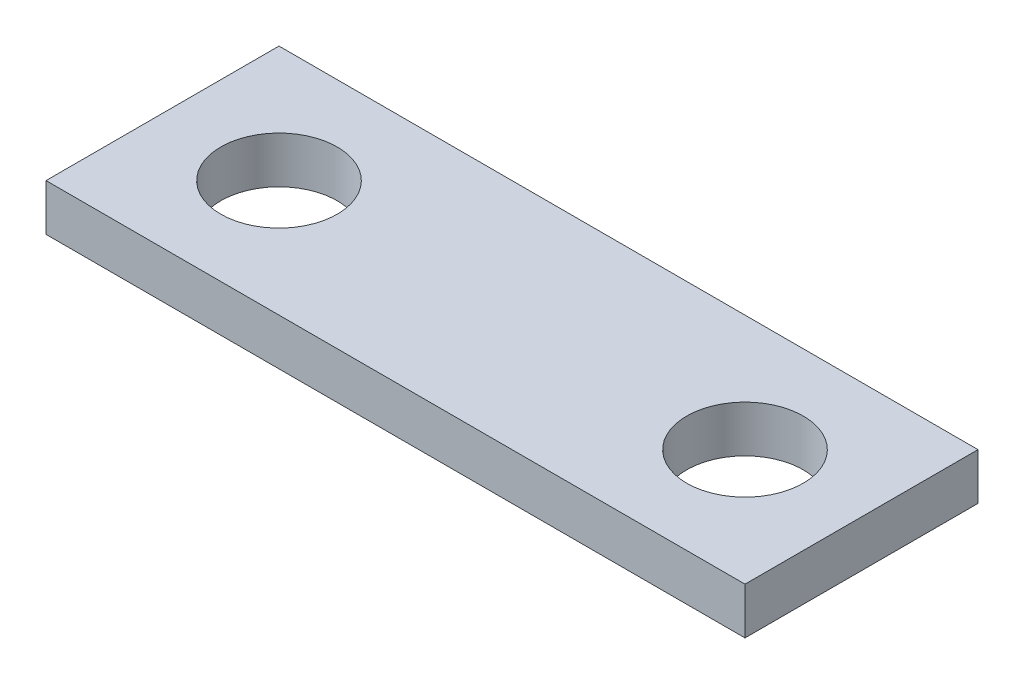
ISO-10303-21;
HEADER;
FILE_DESCRIPTION(('STEP AP214'),'2;1');
FILE_NAME('part.step','',(''),(''),'','','');
FILE_SCHEMA(('AUTOMOTIVE_DESIGN { 1 0 10303 214 1 1 1 1 }'));
ENDSEC;
DATA;
#1=APPLICATION_CONTEXT('core data for automotive mechanical design processes');
#2=APPLICATION_PROTOCOL_DEFINITION('international standard','automotive_design',2000,#1);
#3=PRODUCT_CONTEXT('',#1,'mechanical');
#4=PRODUCT('Part','Part','',(#3));
#5=PRODUCT_RELATED_PRODUCT_CATEGORY('part','',(#4));
#6=PRODUCT_DEFINITION_FORMATION('','',#4);
#7=PRODUCT_DEFINITION_CONTEXT('part definition',#1,'design');
#8=PRODUCT_DEFINITION('design','',#6,#7);
#9=PRODUCT_DEFINITION_SHAPE('','',#8);
#10=(LENGTH_UNIT() NAMED_UNIT(*) SI_UNIT(.MILLI.,.METRE.));
#11=(NAMED_UNIT(*) PLANE_ANGLE_UNIT() SI_UNIT($,.RADIAN.));
#12=(NAMED_UNIT(*) SI_UNIT($,.STERADIAN.) SOLID_ANGLE_UNIT());
#13=UNCERTAINTY_MEASURE_WITH_UNIT(LENGTH_MEASURE(1.E-05),#10,'distance_accuracy_value','');
#14=(GEOMETRIC_REPRESENTATION_CONTEXT(3) GLOBAL_UNCERTAINTY_ASSIGNED_CONTEXT((#13)) GLOBAL_UNIT_ASSIGNED_CONTEXT((#10,
#11,#12)) REPRESENTATION_CONTEXT('',''));
#15=CARTESIAN_POINT('',(0.,0.,0.));
#16=DIRECTION('',(0.,0.,1.));
#17=DIRECTION('',(1.,0.,0.));
#18=AXIS2_PLACEMENT_3D('',#15,#16,#17);
#19=CARTESIAN_POINT('',(0.,2.,5.));
#20=DIRECTION('',(0.,0.,-1.));
#21=DIRECTION('',(-1.,0.,0.));
#22=AXIS2_PLACEMENT_3D('',#19,#20,#21);
#23=PLANE('',#22);
#24=DIRECTION('',(1.,0.,0.));
#25=VECTOR('',#24,1.);
#26=CARTESIAN_POINT('',(0.,0.,5.));
#27=LINE('',#26,#25);
#28=CARTESIAN_POINT('',(-15.,0.,5.));
#29=VERTEX_POINT('',#28);
#30=CARTESIAN_POINT('',(15.,0.,5.));
#31=VERTEX_POINT('',#30);
#32=EDGE_CURVE('E124',#29,#31,#27,.T.);
#33=ORIENTED_EDGE('',*,*,#32,.T.);
#34=DIRECTION('',(0.,-1.,0.));
#35=VECTOR('',#34,1.);
#36=CARTESIAN_POINT('',(15.,2.,5.));
#37=LINE('',#36,#35);
#38=CARTESIAN_POINT('',(15.,2.,5.));
#39=VERTEX_POINT('',#38);
#40=EDGE_CURVE('E11',#39,#31,#37,.T.);
#41=ORIENTED_EDGE('',*,*,#40,.F.);
#42=DIRECTION('',(1.,0.,0.));
#43=VECTOR('',#42,1.);
#44=CARTESIAN_POINT('',(0.,2.,5.));
#45=LINE('',#44,#43);
#46=CARTESIAN_POINT('',(-15.,2.,5.));
#47=VERTEX_POINT('',#46);
#48=EDGE_CURVE('E98',#47,#39,#45,.T.);
#49=ORIENTED_EDGE('',*,*,#48,.F.);
#50=DIRECTION('',(0.,-1.,0.));
#51=VECTOR('',#50,1.);
#52=CARTESIAN_POINT('',(-15.,2.,5.));
#53=LINE('',#52,#51);
#54=EDGE_CURVE('E65',#47,#29,#53,.T.);
#55=ORIENTED_EDGE('',*,*,#54,.T.);
#56=EDGE_LOOP('',(#33,#41,#49,#55));
#57=FACE_BOUND('',#56,.T.);
#58=ADVANCED_FACE('F47',(#57),#23,.F.);
#59=CARTESIAN_POINT('',(15.,2.,0.));
#60=DIRECTION('',(-1.,0.,0.));
#61=DIRECTION('',(0.,0.,1.));
#62=AXIS2_PLACEMENT_3D('',#59,#60,#61);
#63=PLANE('',#62);
#64=DIRECTION('',(0.,0.,-1.));
#65=VECTOR('',#64,1.);
#66=CARTESIAN_POINT('',(15.,0.,0.));
#67=LINE('',#66,#65);
#68=CARTESIAN_POINT('',(15.,0.,-5.));
#69=VERTEX_POINT('',#68);
#70=EDGE_CURVE('E104',#31,#69,#67,.T.);
#71=ORIENTED_EDGE('',*,*,#70,.T.);
#72=DIRECTION('',(0.,-1.,0.));
#73=VECTOR('',#72,1.);
#74=CARTESIAN_POINT('',(15.,2.,-5.));
#75=LINE('',#74,#73);
#76=CARTESIAN_POINT('',(15.,2.,-5.));
#77=VERTEX_POINT('',#76);
#78=EDGE_CURVE('E57',#77,#69,#75,.T.);
#79=ORIENTED_EDGE('',*,*,#78,.F.);
#80=DIRECTION('',(0.,0.,-1.));
#81=VECTOR('',#80,1.);
#82=CARTESIAN_POINT('',(15.,2.,0.));
#83=LINE('',#82,#81);
#84=EDGE_CURVE('E90',#39,#77,#83,.T.);
#85=ORIENTED_EDGE('',*,*,#84,.F.);
#86=ORIENTED_EDGE('',*,*,#40,.T.);
#87=EDGE_LOOP('',(#71,#79,#85,#86));
#88=FACE_BOUND('',#87,.T.);
#89=ADVANCED_FACE('F103',(#88),#63,.F.);
#90=CARTESIAN_POINT('',(0.,2.,-5.));
#91=DIRECTION('',(0.,0.,-1.));
#92=DIRECTION('',(-1.,0.,0.));
#93=AXIS2_PLACEMENT_3D('',#90,#91,#92);
#94=PLANE('',#93);
#95=DIRECTION('',(1.,0.,0.));
#96=VECTOR('',#95,1.);
#97=CARTESIAN_POINT('',(0.,0.,-5.));
#98=LINE('',#97,#96);
#99=CARTESIAN_POINT('',(-15.,0.,-5.));
#100=VERTEX_POINT('',#99);
#101=EDGE_CURVE('E129',#100,#69,#98,.T.);
#102=ORIENTED_EDGE('',*,*,#101,.F.);
#103=DIRECTION('',(0.,-1.,0.));
#104=VECTOR('',#103,1.);
#105=CARTESIAN_POINT('',(-15.,2.,-5.));
#106=LINE('',#105,#104);
#107=CARTESIAN_POINT('',(-15.,2.,-5.));
#108=VERTEX_POINT('',#107);
#109=EDGE_CURVE('E79',#108,#100,#106,.T.);
#110=ORIENTED_EDGE('',*,*,#109,.F.);
#111=DIRECTION('',(1.,0.,0.));
#112=VECTOR('',#111,1.);
#113=CARTESIAN_POINT('',(0.,2.,-5.));
#114=LINE('',#113,#112);
#115=EDGE_CURVE('E97',#108,#77,#114,.T.);
#116=ORIENTED_EDGE('',*,*,#115,.T.);
#117=ORIENTED_EDGE('',*,*,#78,.T.);
#118=EDGE_LOOP('',(#102,#110,#116,#117));
#119=FACE_BOUND('',#118,.T.);
#120=ADVANCED_FACE('F108',(#119),#94,.T.);
#121=CARTESIAN_POINT('',(-10.,2.,0.));
#122=DIRECTION('',(0.,-1.,0.));
#123=DIRECTION('',(0.,0.,-1.));
#124=AXIS2_PLACEMENT_3D('',#121,#122,#123);
#125=CYLINDRICAL_SURFACE('',#124,2.5);
#126=CARTESIAN_POINT('',(-10.,2.,0.));
#127=DIRECTION('',(0.,1.,0.));
#128=DIRECTION('',(0.,0.,1.));
#129=AXIS2_PLACEMENT_3D('',#126,#127,#128);
#130=CIRCLE('',#129,2.5);
#131=CARTESIAN_POINT('',(-10.,2.,2.5));
#132=VERTEX_POINT('',#131);
#133=EDGE_CURVE('E143',#132,#132,#130,.T.);
#134=ORIENTED_EDGE('',*,*,#133,.T.);
#135=EDGE_LOOP('',(#134));
#136=FACE_BOUND('',#135,.T.);
#137=CARTESIAN_POINT('',(-10.,0.,0.));
#138=DIRECTION('',(0.,1.,0.));
#139=DIRECTION('',(0.,0.,1.));
#140=AXIS2_PLACEMENT_3D('',#137,#138,#139);
#141=CIRCLE('',#140,2.5);
#142=CARTESIAN_POINT('',(-10.,0.,2.5));
#143=VERTEX_POINT('',#142);
#144=EDGE_CURVE('E120',#143,#143,#141,.T.);
#145=ORIENTED_EDGE('',*,*,#144,.F.);
#146=EDGE_LOOP('',(#145));
#147=FACE_BOUND('',#146,.T.);
#148=ADVANCED_FACE('F153',(#136,#147),#125,.F.);
#149=CARTESIAN_POINT('',(9.99999999999999,2.,0.));
#150=DIRECTION('',(0.,-1.,0.));
#151=DIRECTION('',(0.,0.,-1.));
#152=AXIS2_PLACEMENT_3D('',#149,#150,#151);
#153=CYLINDRICAL_SURFACE('',#152,2.5);
#154=CARTESIAN_POINT('',(9.99999999999999,2.,0.));
#155=DIRECTION('',(0.,1.,0.));
#156=DIRECTION('',(0.,0.,1.));
#157=AXIS2_PLACEMENT_3D('',#154,#155,#156);
#158=CIRCLE('',#157,2.5);
#159=CARTESIAN_POINT('',(9.99999999999999,2.,2.5));
#160=VERTEX_POINT('',#159);
#161=EDGE_CURVE('E136',#160,#160,#158,.T.);
#162=ORIENTED_EDGE('',*,*,#161,.T.);
#163=EDGE_LOOP('',(#162));
#164=FACE_BOUND('',#163,.T.);
#165=CARTESIAN_POINT('',(9.99999999999999,0.,0.));
#166=DIRECTION('',(0.,1.,0.));
#167=DIRECTION('',(0.,0.,1.));
#168=AXIS2_PLACEMENT_3D('',#165,#166,#167);
#169=CIRCLE('',#168,2.5);
#170=CARTESIAN_POINT('',(9.99999999999999,0.,2.5));
#171=VERTEX_POINT('',#170);
#172=EDGE_CURVE('E116',#171,#171,#169,.T.);
#173=ORIENTED_EDGE('',*,*,#172,.F.);
#174=EDGE_LOOP('',(#173));
#175=FACE_BOUND('',#174,.T.);
#176=ADVANCED_FACE('F49',(#164,#175),#153,.F.);
#177=CARTESIAN_POINT('',(-15.,2.,0.));
#178=DIRECTION('',(-1.,0.,0.));
#179=DIRECTION('',(0.,0.,1.));
#180=AXIS2_PLACEMENT_3D('',#177,#178,#179);
#181=PLANE('',#180);
#182=DIRECTION('',(0.,0.,-1.));
#183=VECTOR('',#182,1.);
#184=CARTESIAN_POINT('',(-15.,0.,0.));
#185=LINE('',#184,#183);
#186=EDGE_CURVE('E132',#29,#100,#185,.T.);
#187=ORIENTED_EDGE('',*,*,#186,.F.);
#188=ORIENTED_EDGE('',*,*,#54,.F.);
#189=DIRECTION('',(0.,0.,-1.));
#190=VECTOR('',#189,1.);
#191=CARTESIAN_POINT('',(-15.,2.,0.));
#192=LINE('',#191,#190);
#193=EDGE_CURVE('E110',#47,#108,#192,.T.);
#194=ORIENTED_EDGE('',*,*,#193,.T.);
#195=ORIENTED_EDGE('',*,*,#109,.T.);
#196=EDGE_LOOP('',(#187,#188,#194,#195));
#197=FACE_BOUND('',#196,.T.);
#198=ADVANCED_FACE('F158',(#197),#181,.T.);
#199=CARTESIAN_POINT('',(0.,2.,0.));
#200=DIRECTION('',(0.,1.,0.));
#201=DIRECTION('',(0.,0.,1.));
#202=AXIS2_PLACEMENT_3D('',#199,#200,#201);
#203=PLANE('',#202);
#204=ORIENTED_EDGE('',*,*,#161,.F.);
#205=EDGE_LOOP('',(#204));
#206=FACE_BOUND('',#205,.T.);
#207=ORIENTED_EDGE('',*,*,#133,.F.);
#208=EDGE_LOOP('',(#207));
#209=FACE_BOUND('',#208,.T.);
#210=ORIENTED_EDGE('',*,*,#48,.T.);
#211=ORIENTED_EDGE('',*,*,#84,.T.);
#212=ORIENTED_EDGE('',*,*,#115,.F.);
#213=ORIENTED_EDGE('',*,*,#193,.F.);
#214=EDGE_LOOP('',(#210,#211,#212,#213));
#215=FACE_BOUND('',#214,.T.);
#216=ADVANCED_FACE('F94',(#206,#209,#215),#203,.T.);
#217=CARTESIAN_POINT('',(0.,0.,0.));
#218=DIRECTION('',(0.,1.,0.));
#219=DIRECTION('',(0.,0.,1.));
#220=AXIS2_PLACEMENT_3D('',#217,#218,#219);
#221=PLANE('',#220);
#222=ORIENTED_EDGE('',*,*,#172,.T.);
#223=EDGE_LOOP('',(#222));
#224=FACE_BOUND('',#223,.T.);
#225=ORIENTED_EDGE('',*,*,#144,.T.);
#226=EDGE_LOOP('',(#225));
#227=FACE_BOUND('',#226,.T.);
#228=ORIENTED_EDGE('',*,*,#32,.F.);
#229=ORIENTED_EDGE('',*,*,#186,.T.);
#230=ORIENTED_EDGE('',*,*,#101,.T.);
#231=ORIENTED_EDGE('',*,*,#70,.F.);
#232=EDGE_LOOP('',(#228,#229,#230,#231));
#233=FACE_BOUND('',#232,.T.);
#234=ADVANCED_FACE('F157',(#224,#227,#233),#221,.F.);
#235=CLOSED_SHELL('',(#58,#89,#120,#148,#176,#198,#216,#234));
#236=MANIFOLD_SOLID_BREP('B2',#235);
#237=ADVANCED_BREP_SHAPE_REPRESENTATION('',(#18,#236),#14);
#238=SHAPE_DEFINITION_REPRESENTATION(#9,#237);
ENDSEC;
END-ISO-10303-21;
